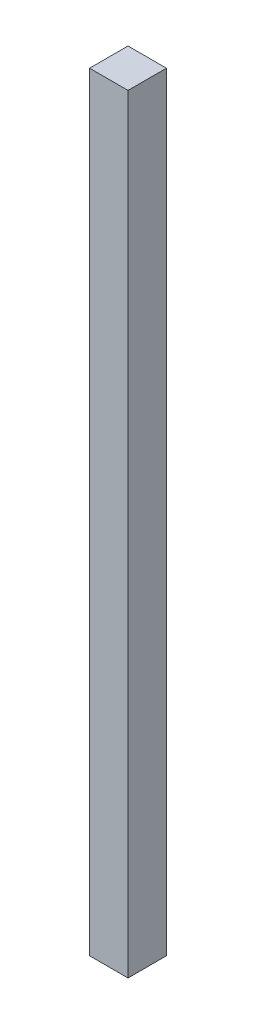
ISO-10303-21;
HEADER;
FILE_DESCRIPTION(('STEP AP214'),'2;1');
FILE_NAME('part.step','',(''),(''),'','','');
FILE_SCHEMA(('AUTOMOTIVE_DESIGN { 1 0 10303 214 1 1 1 1 }'));
ENDSEC;
DATA;
#1=APPLICATION_CONTEXT('core data for automotive mechanical design processes');
#2=APPLICATION_PROTOCOL_DEFINITION('international standard','automotive_design',2000,#1);
#3=PRODUCT_CONTEXT('',#1,'mechanical');
#4=PRODUCT('Part','Part','',(#3));
#5=PRODUCT_RELATED_PRODUCT_CATEGORY('part','',(#4));
#6=PRODUCT_DEFINITION_FORMATION('','',#4);
#7=PRODUCT_DEFINITION_CONTEXT('part definition',#1,'design');
#8=PRODUCT_DEFINITION('design','',#6,#7);
#9=PRODUCT_DEFINITION_SHAPE('','',#8);
#10=(LENGTH_UNIT() NAMED_UNIT(*) SI_UNIT(.MILLI.,.METRE.));
#11=(NAMED_UNIT(*) PLANE_ANGLE_UNIT() SI_UNIT($,.RADIAN.));
#12=(NAMED_UNIT(*) SI_UNIT($,.STERADIAN.) SOLID_ANGLE_UNIT());
#13=UNCERTAINTY_MEASURE_WITH_UNIT(LENGTH_MEASURE(1.E-05),#10,'distance_accuracy_value','');
#14=(GEOMETRIC_REPRESENTATION_CONTEXT(3) GLOBAL_UNCERTAINTY_ASSIGNED_CONTEXT((#13)) GLOBAL_UNIT_ASSIGNED_CONTEXT((#10,
#11,#12)) REPRESENTATION_CONTEXT('',''));
#15=CARTESIAN_POINT('',(0.,0.,0.));
#16=DIRECTION('',(0.,0.,1.));
#17=DIRECTION('',(1.,0.,0.));
#18=AXIS2_PLACEMENT_3D('',#15,#16,#17);
#19=CARTESIAN_POINT('',(-0.625,25.,0.625));
#20=DIRECTION('',(1.,0.,0.));
#21=DIRECTION('',(0.,0.,-1.));
#22=AXIS2_PLACEMENT_3D('',#19,#20,#21);
#23=PLANE('',#22);
#24=DIRECTION('',(0.,0.,1.));
#25=VECTOR('',#24,1.);
#26=CARTESIAN_POINT('',(-0.625,0.,0.625));
#27=LINE('',#26,#25);
#28=CARTESIAN_POINT('',(-0.625,0.,-0.625));
#29=VERTEX_POINT('',#28);
#30=CARTESIAN_POINT('',(-0.625,0.,0.625));
#31=VERTEX_POINT('',#30);
#32=EDGE_CURVE('E96',#29,#31,#27,.T.);
#33=ORIENTED_EDGE('',*,*,#32,.T.);
#34=DIRECTION('',(0.,-1.,0.));
#35=VECTOR('',#34,1.);
#36=CARTESIAN_POINT('',(-0.625,25.,0.625));
#37=LINE('',#36,#35);
#38=CARTESIAN_POINT('',(-0.625,25.,0.625));
#39=VERTEX_POINT('',#38);
#40=EDGE_CURVE('E11',#39,#31,#37,.T.);
#41=ORIENTED_EDGE('',*,*,#40,.F.);
#42=DIRECTION('',(0.,0.,1.));
#43=VECTOR('',#42,1.);
#44=CARTESIAN_POINT('',(-0.625,25.,0.625));
#45=LINE('',#44,#43);
#46=CARTESIAN_POINT('',(-0.625,25.,-0.625));
#47=VERTEX_POINT('',#46);
#48=EDGE_CURVE('E84',#47,#39,#45,.T.);
#49=ORIENTED_EDGE('',*,*,#48,.F.);
#50=DIRECTION('',(0.,-1.,0.));
#51=VECTOR('',#50,1.);
#52=CARTESIAN_POINT('',(-0.625,25.,-0.625));
#53=LINE('',#52,#51);
#54=EDGE_CURVE('E92',#47,#29,#53,.T.);
#55=ORIENTED_EDGE('',*,*,#54,.T.);
#56=EDGE_LOOP('',(#33,#41,#49,#55));
#57=FACE_BOUND('',#56,.T.);
#58=ADVANCED_FACE('F33',(#57),#23,.F.);
#59=CARTESIAN_POINT('',(0.625,25.,0.625));
#60=DIRECTION('',(0.,0.,-1.));
#61=DIRECTION('',(-1.,0.,0.));
#62=AXIS2_PLACEMENT_3D('',#59,#60,#61);
#63=PLANE('',#62);
#64=DIRECTION('',(1.,0.,0.));
#65=VECTOR('',#64,1.);
#66=CARTESIAN_POINT('',(0.625,0.,0.625));
#67=LINE('',#66,#65);
#68=CARTESIAN_POINT('',(0.625,0.,0.625));
#69=VERTEX_POINT('',#68);
#70=EDGE_CURVE('E88',#31,#69,#67,.T.);
#71=ORIENTED_EDGE('',*,*,#70,.T.);
#72=DIRECTION('',(0.,-1.,0.));
#73=VECTOR('',#72,1.);
#74=CARTESIAN_POINT('',(0.625,25.,0.625));
#75=LINE('',#74,#73);
#76=CARTESIAN_POINT('',(0.625,25.,0.625));
#77=VERTEX_POINT('',#76);
#78=EDGE_CURVE('E41',#77,#69,#75,.T.);
#79=ORIENTED_EDGE('',*,*,#78,.F.);
#80=DIRECTION('',(1.,0.,0.));
#81=VECTOR('',#80,1.);
#82=CARTESIAN_POINT('',(0.625,25.,0.625));
#83=LINE('',#82,#81);
#84=EDGE_CURVE('E79',#39,#77,#83,.T.);
#85=ORIENTED_EDGE('',*,*,#84,.F.);
#86=ORIENTED_EDGE('',*,*,#40,.T.);
#87=EDGE_LOOP('',(#71,#79,#85,#86));
#88=FACE_BOUND('',#87,.T.);
#89=ADVANCED_FACE('F87',(#88),#63,.F.);
#90=CARTESIAN_POINT('',(0.625,25.,0.625));
#91=DIRECTION('',(-1.,0.,0.));
#92=DIRECTION('',(0.,0.,1.));
#93=AXIS2_PLACEMENT_3D('',#90,#91,#92);
#94=PLANE('',#93);
#95=DIRECTION('',(0.,0.,-1.));
#96=VECTOR('',#95,1.);
#97=CARTESIAN_POINT('',(0.625,0.,0.625));
#98=LINE('',#97,#96);
#99=CARTESIAN_POINT('',(0.625,0.,-0.625));
#100=VERTEX_POINT('',#99);
#101=EDGE_CURVE('E66',#69,#100,#98,.T.);
#102=ORIENTED_EDGE('',*,*,#101,.T.);
#103=DIRECTION('',(0.,-1.,0.));
#104=VECTOR('',#103,1.);
#105=CARTESIAN_POINT('',(0.625,25.,-0.625));
#106=LINE('',#105,#104);
#107=CARTESIAN_POINT('',(0.625,25.,-0.625));
#108=VERTEX_POINT('',#107);
#109=EDGE_CURVE('E89',#108,#100,#106,.T.);
#110=ORIENTED_EDGE('',*,*,#109,.F.);
#111=DIRECTION('',(0.,0.,-1.));
#112=VECTOR('',#111,1.);
#113=CARTESIAN_POINT('',(0.625,25.,0.625));
#114=LINE('',#113,#112);
#115=EDGE_CURVE('E82',#77,#108,#114,.T.);
#116=ORIENTED_EDGE('',*,*,#115,.F.);
#117=ORIENTED_EDGE('',*,*,#78,.T.);
#118=EDGE_LOOP('',(#102,#110,#116,#117));
#119=FACE_BOUND('',#118,.T.);
#120=ADVANCED_FACE('F90',(#119),#94,.F.);
#121=CARTESIAN_POINT('',(0.625,25.,-0.625));
#122=DIRECTION('',(0.,0.,1.));
#123=DIRECTION('',(1.,0.,0.));
#124=AXIS2_PLACEMENT_3D('',#121,#122,#123);
#125=PLANE('',#124);
#126=DIRECTION('',(-1.,0.,0.));
#127=VECTOR('',#126,1.);
#128=CARTESIAN_POINT('',(0.625,0.,-0.625));
#129=LINE('',#128,#127);
#130=EDGE_CURVE('E72',#100,#29,#129,.T.);
#131=ORIENTED_EDGE('',*,*,#130,.T.);
#132=ORIENTED_EDGE('',*,*,#54,.F.);
#133=DIRECTION('',(-1.,0.,0.));
#134=VECTOR('',#133,1.);
#135=CARTESIAN_POINT('',(0.625,25.,-0.625));
#136=LINE('',#135,#134);
#137=EDGE_CURVE('E49',#108,#47,#136,.T.);
#138=ORIENTED_EDGE('',*,*,#137,.F.);
#139=ORIENTED_EDGE('',*,*,#109,.T.);
#140=EDGE_LOOP('',(#131,#132,#138,#139));
#141=FACE_BOUND('',#140,.T.);
#142=ADVANCED_FACE('F103',(#141),#125,.F.);
#143=CARTESIAN_POINT('',(0.,25.,0.));
#144=DIRECTION('',(0.,1.,0.));
#145=DIRECTION('',(0.,0.,1.));
#146=AXIS2_PLACEMENT_3D('',#143,#144,#145);
#147=PLANE('',#146);
#148=ORIENTED_EDGE('',*,*,#48,.T.);
#149=ORIENTED_EDGE('',*,*,#84,.T.);
#150=ORIENTED_EDGE('',*,*,#115,.T.);
#151=ORIENTED_EDGE('',*,*,#137,.T.);
#152=EDGE_LOOP('',(#148,#149,#150,#151));
#153=FACE_BOUND('',#152,.T.);
#154=ADVANCED_FACE('F80',(#153),#147,.T.);
#155=CARTESIAN_POINT('',(0.,0.,0.));
#156=DIRECTION('',(0.,1.,0.));
#157=DIRECTION('',(0.,0.,1.));
#158=AXIS2_PLACEMENT_3D('',#155,#156,#157);
#159=PLANE('',#158);
#160=ORIENTED_EDGE('',*,*,#32,.F.);
#161=ORIENTED_EDGE('',*,*,#130,.F.);
#162=ORIENTED_EDGE('',*,*,#101,.F.);
#163=ORIENTED_EDGE('',*,*,#70,.F.);
#164=EDGE_LOOP('',(#160,#161,#162,#163));
#165=FACE_BOUND('',#164,.T.);
#166=ADVANCED_FACE('F106',(#165),#159,.F.);
#167=CLOSED_SHELL('',(#58,#89,#120,#142,#154,#166));
#168=MANIFOLD_SOLID_BREP('B2',#167);
#169=ADVANCED_BREP_SHAPE_REPRESENTATION('',(#18,#168),#14);
#170=SHAPE_DEFINITION_REPRESENTATION(#9,#169);
ENDSEC;
END-ISO-10303-21;
